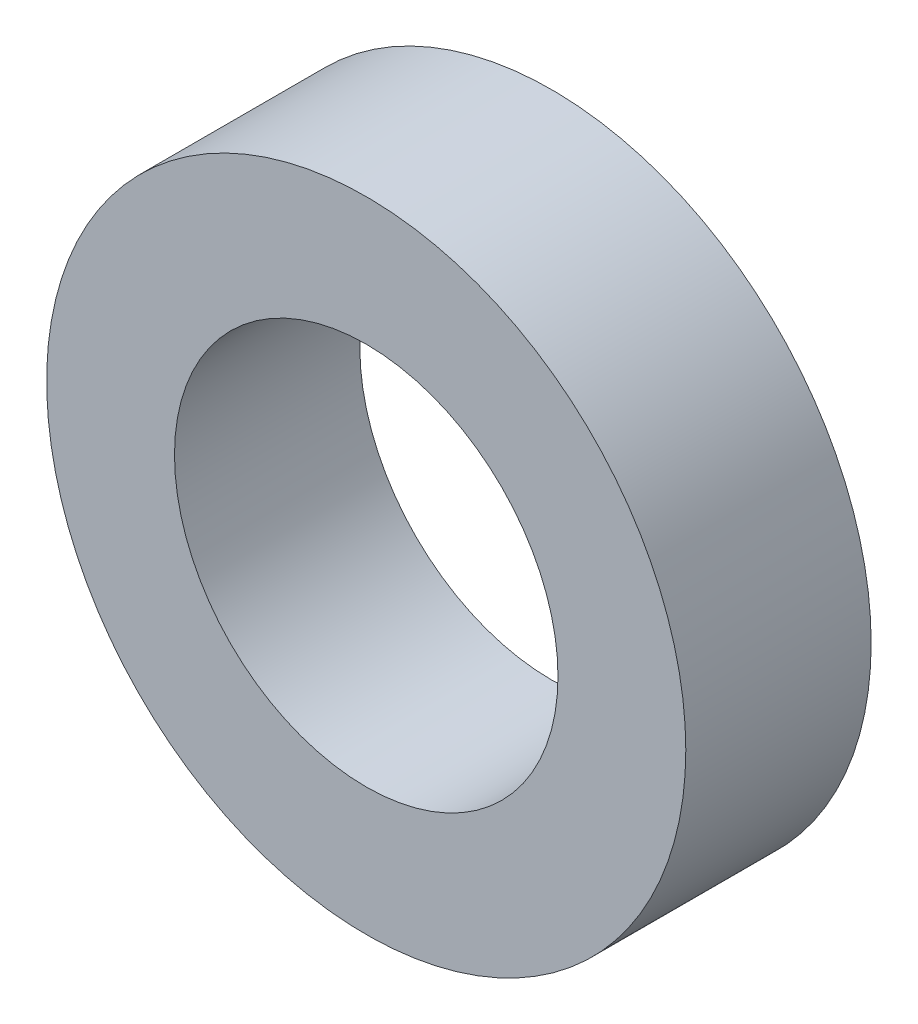
ISO-10303-21;
HEADER;
FILE_DESCRIPTION(('STEP AP214'),'2;1');
FILE_NAME('part.step','',(''),(''),'','','');
FILE_SCHEMA(('AUTOMOTIVE_DESIGN { 1 0 10303 214 1 1 1 1 }'));
ENDSEC;
DATA;
#1=APPLICATION_CONTEXT('core data for automotive mechanical design processes');
#2=APPLICATION_PROTOCOL_DEFINITION('international standard','automotive_design',2000,#1);
#3=PRODUCT_CONTEXT('',#1,'mechanical');
#4=PRODUCT('Part','Part','',(#3));
#5=PRODUCT_RELATED_PRODUCT_CATEGORY('part','',(#4));
#6=PRODUCT_DEFINITION_FORMATION('','',#4);
#7=PRODUCT_DEFINITION_CONTEXT('part definition',#1,'design');
#8=PRODUCT_DEFINITION('design','',#6,#7);
#9=PRODUCT_DEFINITION_SHAPE('','',#8);
#10=(LENGTH_UNIT() NAMED_UNIT(*) SI_UNIT(.MILLI.,.METRE.));
#11=(NAMED_UNIT(*) PLANE_ANGLE_UNIT() SI_UNIT($,.RADIAN.));
#12=(NAMED_UNIT(*) SI_UNIT($,.STERADIAN.) SOLID_ANGLE_UNIT());
#13=UNCERTAINTY_MEASURE_WITH_UNIT(LENGTH_MEASURE(1.E-05),#10,'distance_accuracy_value','');
#14=(GEOMETRIC_REPRESENTATION_CONTEXT(3) GLOBAL_UNCERTAINTY_ASSIGNED_CONTEXT((#13)) GLOBAL_UNIT_ASSIGNED_CONTEXT((#10,
#11,#12)) REPRESENTATION_CONTEXT('',''));
#15=CARTESIAN_POINT('',(0.,0.,0.));
#16=DIRECTION('',(0.,0.,1.));
#17=DIRECTION('',(1.,0.,0.));
#18=AXIS2_PLACEMENT_3D('',#15,#16,#17);
#19=CARTESIAN_POINT('',(0.,0.,2.9));
#20=DIRECTION('',(0.,0.,1.));
#21=DIRECTION('',(1.,0.,0.));
#22=AXIS2_PLACEMENT_3D('',#19,#20,#21);
#23=PLANE('',#22);
#24=CARTESIAN_POINT('',(0.,0.,2.9));
#25=DIRECTION('',(0.,0.,1.));
#26=DIRECTION('',(1.,0.,0.));
#27=AXIS2_PLACEMENT_3D('',#24,#25,#26);
#28=CIRCLE('',#27,5.);
#29=CARTESIAN_POINT('',(5.,0.,2.9));
#30=VERTEX_POINT('',#29);
#31=EDGE_CURVE('E10',#30,#30,#28,.T.);
#32=ORIENTED_EDGE('',*,*,#31,.T.);
#33=EDGE_LOOP('',(#32));
#34=FACE_BOUND('',#33,.T.);
#35=CARTESIAN_POINT('',(0.,0.,2.9));
#36=DIRECTION('',(0.,0.,1.));
#37=DIRECTION('',(1.,0.,0.));
#38=AXIS2_PLACEMENT_3D('',#35,#36,#37);
#39=CIRCLE('',#38,3.);
#40=CARTESIAN_POINT('',(3.,0.,2.9));
#41=VERTEX_POINT('',#40);
#42=EDGE_CURVE('E41',#41,#41,#39,.T.);
#43=ORIENTED_EDGE('',*,*,#42,.F.);
#44=EDGE_LOOP('',(#43));
#45=FACE_BOUND('',#44,.T.);
#46=ADVANCED_FACE('F30',(#34,#45),#23,.T.);
#47=CARTESIAN_POINT('',(0.,0.,0.));
#48=DIRECTION('',(0.,0.,1.));
#49=DIRECTION('',(1.,0.,0.));
#50=AXIS2_PLACEMENT_3D('',#47,#48,#49);
#51=PLANE('',#50);
#52=CARTESIAN_POINT('',(0.,0.,0.));
#53=DIRECTION('',(0.,0.,1.));
#54=DIRECTION('',(1.,0.,0.));
#55=AXIS2_PLACEMENT_3D('',#52,#53,#54);
#56=CIRCLE('',#55,5.);
#57=CARTESIAN_POINT('',(5.,0.,0.));
#58=VERTEX_POINT('',#57);
#59=EDGE_CURVE('E34',#58,#58,#56,.T.);
#60=ORIENTED_EDGE('',*,*,#59,.F.);
#61=EDGE_LOOP('',(#60));
#62=FACE_BOUND('',#61,.T.);
#63=CARTESIAN_POINT('',(0.,0.,0.));
#64=DIRECTION('',(0.,0.,1.));
#65=DIRECTION('',(1.,0.,0.));
#66=AXIS2_PLACEMENT_3D('',#63,#64,#65);
#67=CIRCLE('',#66,3.);
#68=CARTESIAN_POINT('',(3.,0.,0.));
#69=VERTEX_POINT('',#68);
#70=EDGE_CURVE('E43',#69,#69,#67,.T.);
#71=ORIENTED_EDGE('',*,*,#70,.T.);
#72=EDGE_LOOP('',(#71));
#73=FACE_BOUND('',#72,.T.);
#74=ADVANCED_FACE('F53',(#62,#73),#51,.F.);
#75=CARTESIAN_POINT('',(0.,0.,2.9));
#76=DIRECTION('',(0.,0.,-1.));
#77=DIRECTION('',(-1.,0.,0.));
#78=AXIS2_PLACEMENT_3D('',#75,#76,#77);
#79=CYLINDRICAL_SURFACE('',#78,5.);
#80=ORIENTED_EDGE('',*,*,#31,.F.);
#81=EDGE_LOOP('',(#80));
#82=FACE_BOUND('',#81,.T.);
#83=ORIENTED_EDGE('',*,*,#59,.T.);
#84=EDGE_LOOP('',(#83));
#85=FACE_BOUND('',#84,.T.);
#86=ADVANCED_FACE('F32',(#82,#85),#79,.T.);
#87=CARTESIAN_POINT('',(0.,0.,2.9));
#88=DIRECTION('',(0.,0.,-1.));
#89=DIRECTION('',(-1.,0.,0.));
#90=AXIS2_PLACEMENT_3D('',#87,#88,#89);
#91=CYLINDRICAL_SURFACE('',#90,3.);
#92=ORIENTED_EDGE('',*,*,#42,.T.);
#93=EDGE_LOOP('',(#92));
#94=FACE_BOUND('',#93,.T.);
#95=ORIENTED_EDGE('',*,*,#70,.F.);
#96=EDGE_LOOP('',(#95));
#97=FACE_BOUND('',#96,.T.);
#98=ADVANCED_FACE('F49',(#94,#97),#91,.F.);
#99=CLOSED_SHELL('',(#46,#74,#86,#98));
#100=MANIFOLD_SOLID_BREP('B2',#99);
#101=ADVANCED_BREP_SHAPE_REPRESENTATION('',(#18,#100),#14);
#102=SHAPE_DEFINITION_REPRESENTATION(#9,#101);
ENDSEC;
END-ISO-10303-21;
